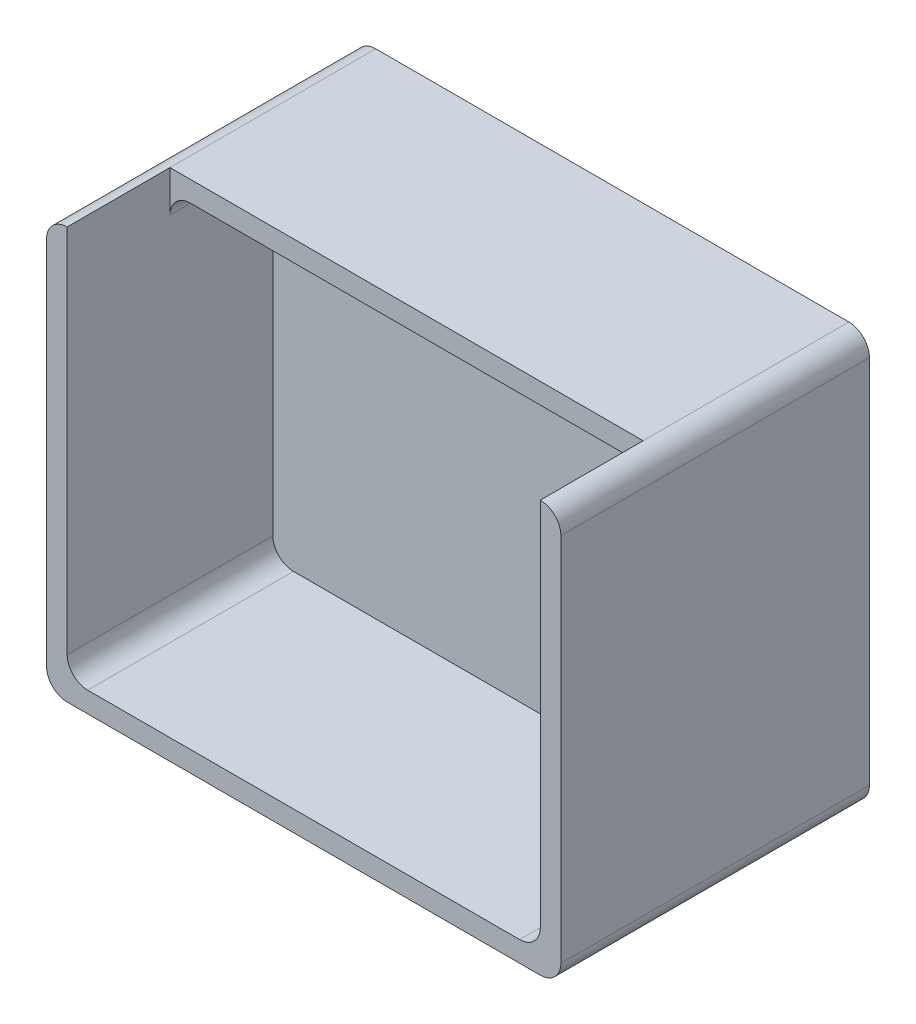
ISO-10303-21;
HEADER;
FILE_DESCRIPTION(('STEP AP214'),'2;1');
FILE_NAME('part.step','',(''),(''),'','','');
FILE_SCHEMA(('AUTOMOTIVE_DESIGN { 1 0 10303 214 1 1 1 1 }'));
ENDSEC;
DATA;
#1=APPLICATION_CONTEXT('core data for automotive mechanical design processes');
#2=APPLICATION_PROTOCOL_DEFINITION('international standard','automotive_design',2000,#1);
#3=PRODUCT_CONTEXT('',#1,'mechanical');
#4=PRODUCT('Part','Part','',(#3));
#5=PRODUCT_RELATED_PRODUCT_CATEGORY('part','',(#4));
#6=PRODUCT_DEFINITION_FORMATION('','',#4);
#7=PRODUCT_DEFINITION_CONTEXT('part definition',#1,'design');
#8=PRODUCT_DEFINITION('design','',#6,#7);
#9=PRODUCT_DEFINITION_SHAPE('','',#8);
#10=(LENGTH_UNIT() NAMED_UNIT(*) SI_UNIT(.MILLI.,.METRE.));
#11=(NAMED_UNIT(*) PLANE_ANGLE_UNIT() SI_UNIT($,.RADIAN.));
#12=(NAMED_UNIT(*) SI_UNIT($,.STERADIAN.) SOLID_ANGLE_UNIT());
#13=UNCERTAINTY_MEASURE_WITH_UNIT(LENGTH_MEASURE(1.E-05),#10,'distance_accuracy_value','');
#14=(GEOMETRIC_REPRESENTATION_CONTEXT(3) GLOBAL_UNCERTAINTY_ASSIGNED_CONTEXT((#13)) GLOBAL_UNIT_ASSIGNED_CONTEXT((#10,
#11,#12)) REPRESENTATION_CONTEXT('',''));
#15=CARTESIAN_POINT('',(0.,0.,0.));
#16=DIRECTION('',(0.,0.,1.));
#17=DIRECTION('',(1.,0.,0.));
#18=AXIS2_PLACEMENT_3D('',#15,#16,#17);
#19=CARTESIAN_POINT('',(-12.5,-10.,15.));
#20=DIRECTION('',(1.,0.,0.));
#21=DIRECTION('',(0.,0.,-1.));
#22=AXIS2_PLACEMENT_3D('',#19,#20,#21);
#23=PLANE('',#22);
#24=DIRECTION('',(0.,-1.,0.));
#25=VECTOR('',#24,1.);
#26=CARTESIAN_POINT('',(-12.5,-10.,0.));
#27=LINE('',#26,#25);
#28=CARTESIAN_POINT('',(-12.5,9.,0.));
#29=VERTEX_POINT('',#28);
#30=CARTESIAN_POINT('',(-12.5,-9.,0.));
#31=VERTEX_POINT('',#30);
#32=EDGE_CURVE('E294',#29,#31,#27,.T.);
#33=ORIENTED_EDGE('',*,*,#32,.T.);
#34=DIRECTION('',(0.,0.,-1.));
#35=VECTOR('',#34,1.);
#36=CARTESIAN_POINT('',(-12.5,-9.,15.));
#37=LINE('',#36,#35);
#38=CARTESIAN_POINT('',(-12.5,-9.,15.));
#39=VERTEX_POINT('',#38);
#40=EDGE_CURVE('E354',#31,#39,#37,.F.);
#41=ORIENTED_EDGE('',*,*,#40,.T.);
#42=DIRECTION('',(0.,-1.,0.));
#43=VECTOR('',#42,1.);
#44=CARTESIAN_POINT('',(-12.5,-10.,15.));
#45=LINE('',#44,#43);
#46=CARTESIAN_POINT('',(-12.5,9.,15.));
#47=VERTEX_POINT('',#46);
#48=EDGE_CURVE('E299',#47,#39,#45,.T.);
#49=ORIENTED_EDGE('',*,*,#48,.F.);
#50=DIRECTION('',(0.,0.,-1.));
#51=VECTOR('',#50,1.);
#52=CARTESIAN_POINT('',(-12.5,9.,15.));
#53=LINE('',#52,#51);
#54=EDGE_CURVE('E351',#47,#29,#53,.T.);
#55=ORIENTED_EDGE('',*,*,#54,.T.);
#56=EDGE_LOOP('',(#33,#41,#49,#55));
#57=FACE_BOUND('',#56,.T.);
#58=ADVANCED_FACE('F81',(#57),#23,.F.);
#59=CARTESIAN_POINT('',(12.5,-10.,15.));
#60=DIRECTION('',(0.,1.,0.));
#61=DIRECTION('',(-1.,0.,0.));
#62=AXIS2_PLACEMENT_3D('',#59,#60,#61);
#63=PLANE('',#62);
#64=DIRECTION('',(1.,0.,0.));
#65=VECTOR('',#64,1.);
#66=CARTESIAN_POINT('',(12.5,-10.,0.));
#67=LINE('',#66,#65);
#68=CARTESIAN_POINT('',(-11.5,-10.,0.));
#69=VERTEX_POINT('',#68);
#70=CARTESIAN_POINT('',(11.5,-10.,0.));
#71=VERTEX_POINT('',#70);
#72=EDGE_CURVE('E312',#69,#71,#67,.T.);
#73=ORIENTED_EDGE('',*,*,#72,.T.);
#74=DIRECTION('',(0.,0.,-1.));
#75=VECTOR('',#74,1.);
#76=CARTESIAN_POINT('',(11.5,-10.,15.));
#77=LINE('',#76,#75);
#78=CARTESIAN_POINT('',(11.5,-10.,15.));
#79=VERTEX_POINT('',#78);
#80=EDGE_CURVE('E335',#71,#79,#77,.F.);
#81=ORIENTED_EDGE('',*,*,#80,.T.);
#82=DIRECTION('',(1.,0.,0.));
#83=VECTOR('',#82,1.);
#84=CARTESIAN_POINT('',(12.5,-10.,15.));
#85=LINE('',#84,#83);
#86=CARTESIAN_POINT('',(-11.5,-10.,15.));
#87=VERTEX_POINT('',#86);
#88=EDGE_CURVE('E302',#87,#79,#85,.T.);
#89=ORIENTED_EDGE('',*,*,#88,.F.);
#90=DIRECTION('',(0.,0.,-1.));
#91=VECTOR('',#90,1.);
#92=CARTESIAN_POINT('',(-11.5,-10.,15.));
#93=LINE('',#92,#91);
#94=EDGE_CURVE('E332',#87,#69,#93,.T.);
#95=ORIENTED_EDGE('',*,*,#94,.T.);
#96=EDGE_LOOP('',(#73,#81,#89,#95));
#97=FACE_BOUND('',#96,.T.);
#98=ADVANCED_FACE('F395',(#97),#63,.F.);
#99=CARTESIAN_POINT('',(12.5,-10.,15.));
#100=DIRECTION('',(-1.,0.,0.));
#101=DIRECTION('',(0.,0.,1.));
#102=AXIS2_PLACEMENT_3D('',#99,#100,#101);
#103=PLANE('',#102);
#104=DIRECTION('',(0.,1.,0.));
#105=VECTOR('',#104,1.);
#106=CARTESIAN_POINT('',(12.5,-10.,15.));
#107=LINE('',#106,#105);
#108=CARTESIAN_POINT('',(12.5,-9.,15.));
#109=VERTEX_POINT('',#108);
#110=CARTESIAN_POINT('',(12.5,9.,15.));
#111=VERTEX_POINT('',#110);
#112=EDGE_CURVE('E306',#109,#111,#107,.T.);
#113=ORIENTED_EDGE('',*,*,#112,.F.);
#114=DIRECTION('',(0.,0.,-1.));
#115=VECTOR('',#114,1.);
#116=CARTESIAN_POINT('',(12.5,-9.,15.));
#117=LINE('',#116,#115);
#118=CARTESIAN_POINT('',(12.5,-9.,0.));
#119=VERTEX_POINT('',#118);
#120=EDGE_CURVE('E321',#109,#119,#117,.T.);
#121=ORIENTED_EDGE('',*,*,#120,.T.);
#122=DIRECTION('',(0.,1.,0.));
#123=VECTOR('',#122,1.);
#124=CARTESIAN_POINT('',(12.5,-10.,0.));
#125=LINE('',#124,#123);
#126=CARTESIAN_POINT('',(12.5,9.,0.));
#127=VERTEX_POINT('',#126);
#128=EDGE_CURVE('E315',#119,#127,#125,.T.);
#129=ORIENTED_EDGE('',*,*,#128,.T.);
#130=DIRECTION('',(0.,0.,-1.));
#131=VECTOR('',#130,1.);
#132=CARTESIAN_POINT('',(12.5,9.,15.));
#133=LINE('',#132,#131);
#134=EDGE_CURVE('E309',#127,#111,#133,.F.);
#135=ORIENTED_EDGE('',*,*,#134,.T.);
#136=EDGE_LOOP('',(#113,#121,#129,#135));
#137=FACE_BOUND('',#136,.T.);
#138=ADVANCED_FACE('F390',(#137),#103,.F.);
#139=CARTESIAN_POINT('',(12.5,10.,15.));
#140=DIRECTION('',(0.,-1.,0.));
#141=DIRECTION('',(1.,0.,0.));
#142=AXIS2_PLACEMENT_3D('',#139,#140,#141);
#143=PLANE('',#142);
#144=DIRECTION('',(0.,0.,-1.));
#145=VECTOR('',#144,1.);
#146=CARTESIAN_POINT('',(-11.5,10.,15.));
#147=LINE('',#146,#145);
#148=CARTESIAN_POINT('',(-11.5,10.,0.));
#149=VERTEX_POINT('',#148);
#150=CARTESIAN_POINT('',(-11.5,10.,10.));
#151=VERTEX_POINT('',#150);
#152=EDGE_CURVE('E346',#149,#151,#147,.F.);
#153=ORIENTED_EDGE('',*,*,#152,.T.);
#154=DIRECTION('',(-1.,0.,0.));
#155=VECTOR('',#154,1.);
#156=CARTESIAN_POINT('',(-11.5,10.,10.));
#157=LINE('',#156,#155);
#158=CARTESIAN_POINT('',(11.5,10.,10.));
#159=VERTEX_POINT('',#158);
#160=EDGE_CURVE('E220',#159,#151,#157,.T.);
#161=ORIENTED_EDGE('',*,*,#160,.F.);
#162=DIRECTION('',(0.,0.,-1.));
#163=VECTOR('',#162,1.);
#164=CARTESIAN_POINT('',(11.5,10.,15.));
#165=LINE('',#164,#163);
#166=CARTESIAN_POINT('',(11.5,10.,0.));
#167=VERTEX_POINT('',#166);
#168=EDGE_CURVE('E349',#159,#167,#165,.T.);
#169=ORIENTED_EDGE('',*,*,#168,.T.);
#170=DIRECTION('',(-1.,0.,0.));
#171=VECTOR('',#170,1.);
#172=CARTESIAN_POINT('',(12.5,10.,0.));
#173=LINE('',#172,#171);
#174=EDGE_CURVE('E303',#167,#149,#173,.T.);
#175=ORIENTED_EDGE('',*,*,#174,.T.);
#176=EDGE_LOOP('',(#153,#161,#169,#175));
#177=FACE_BOUND('',#176,.T.);
#178=ADVANCED_FACE('F382',(#177),#143,.F.);
#179=CARTESIAN_POINT('',(0.,0.,15.));
#180=DIRECTION('',(0.,0.,1.));
#181=DIRECTION('',(1.,0.,0.));
#182=AXIS2_PLACEMENT_3D('',#179,#180,#181);
#183=PLANE('',#182);
#184=DIRECTION('',(0.,-1.,0.));
#185=VECTOR('',#184,1.);
#186=CARTESIAN_POINT('',(-11.5,-9.,15.));
#187=LINE('',#186,#185);
#188=CARTESIAN_POINT('',(-11.5,10.,15.));
#189=VERTEX_POINT('',#188);
#190=CARTESIAN_POINT('',(-11.5,-8.,15.));
#191=VERTEX_POINT('',#190);
#192=EDGE_CURVE('E261',#189,#191,#187,.T.);
#193=ORIENTED_EDGE('',*,*,#192,.F.);
#194=CARTESIAN_POINT('',(-11.5,9.,15.));
#195=DIRECTION('',(0.,0.,1.));
#196=DIRECTION('',(1.,0.,0.));
#197=AXIS2_PLACEMENT_3D('',#194,#195,#196);
#198=CIRCLE('',#197,1.);
#199=EDGE_CURVE('E337',#189,#47,#198,.T.);
#200=ORIENTED_EDGE('',*,*,#199,.T.);
#201=ORIENTED_EDGE('',*,*,#48,.T.);
#202=CARTESIAN_POINT('',(-11.5,-9.,15.));
#203=DIRECTION('',(0.,0.,1.));
#204=DIRECTION('',(1.,0.,0.));
#205=AXIS2_PLACEMENT_3D('',#202,#203,#204);
#206=CIRCLE('',#205,1.);
#207=EDGE_CURVE('E339',#39,#87,#206,.T.);
#208=ORIENTED_EDGE('',*,*,#207,.T.);
#209=ORIENTED_EDGE('',*,*,#88,.T.);
#210=CARTESIAN_POINT('',(11.5,-9.,15.));
#211=DIRECTION('',(0.,0.,1.));
#212=DIRECTION('',(1.,0.,0.));
#213=AXIS2_PLACEMENT_3D('',#210,#211,#212);
#214=CIRCLE('',#213,1.);
#215=EDGE_CURVE('E344',#79,#109,#214,.T.);
#216=ORIENTED_EDGE('',*,*,#215,.T.);
#217=ORIENTED_EDGE('',*,*,#112,.T.);
#218=CARTESIAN_POINT('',(11.5,9.,15.));
#219=DIRECTION('',(0.,0.,1.));
#220=DIRECTION('',(1.,0.,0.));
#221=AXIS2_PLACEMENT_3D('',#218,#219,#220);
#222=CIRCLE('',#221,1.);
#223=CARTESIAN_POINT('',(11.5,10.,15.));
#224=VERTEX_POINT('',#223);
#225=EDGE_CURVE('E341',#111,#224,#222,.T.);
#226=ORIENTED_EDGE('',*,*,#225,.T.);
#227=DIRECTION('',(0.,1.,0.));
#228=VECTOR('',#227,1.);
#229=CARTESIAN_POINT('',(11.5,-9.,15.));
#230=LINE('',#229,#228);
#231=CARTESIAN_POINT('',(11.5,-8.,15.));
#232=VERTEX_POINT('',#231);
#233=EDGE_CURVE('E286',#232,#224,#230,.T.);
#234=ORIENTED_EDGE('',*,*,#233,.F.);
#235=CARTESIAN_POINT('',(10.5,-8.,15.));
#236=DIRECTION('',(0.,0.,1.));
#237=DIRECTION('',(1.,0.,0.));
#238=AXIS2_PLACEMENT_3D('',#235,#236,#237);
#239=CIRCLE('',#238,1.);
#240=CARTESIAN_POINT('',(10.5,-9.,15.));
#241=VERTEX_POINT('',#240);
#242=EDGE_CURVE('E101',#232,#241,#239,.F.);
#243=ORIENTED_EDGE('',*,*,#242,.T.);
#244=DIRECTION('',(1.,0.,0.));
#245=VECTOR('',#244,1.);
#246=CARTESIAN_POINT('',(11.5,-9.,15.));
#247=LINE('',#246,#245);
#248=CARTESIAN_POINT('',(-10.5,-9.,15.));
#249=VERTEX_POINT('',#248);
#250=EDGE_CURVE('E296',#249,#241,#247,.T.);
#251=ORIENTED_EDGE('',*,*,#250,.F.);
#252=CARTESIAN_POINT('',(-10.5,-8.,15.));
#253=DIRECTION('',(0.,0.,1.));
#254=DIRECTION('',(1.,0.,0.));
#255=AXIS2_PLACEMENT_3D('',#252,#253,#254);
#256=CIRCLE('',#255,1.);
#257=EDGE_CURVE('E89',#249,#191,#256,.F.);
#258=ORIENTED_EDGE('',*,*,#257,.T.);
#259=EDGE_LOOP('',(#193,#200,#201,#208,#209,#216,#217,#226,#234,#243,#251,#258));
#260=FACE_BOUND('',#259,.T.);
#261=ADVANCED_FACE('F379',(#260),#183,.T.);
#262=CARTESIAN_POINT('',(0.,0.,0.));
#263=DIRECTION('',(0.,0.,1.));
#264=DIRECTION('',(1.,0.,0.));
#265=AXIS2_PLACEMENT_3D('',#262,#263,#264);
#266=PLANE('',#265);
#267=CARTESIAN_POINT('',(-7.28446597436634,-5.31084146780714,0.));
#268=DIRECTION('',(0.,0.,1.));
#269=DIRECTION('',(1.,0.,0.));
#270=AXIS2_PLACEMENT_3D('',#267,#268,#269);
#271=CIRCLE('',#270,4.);
#272=CARTESIAN_POINT('',(-3.28446597436634,-5.31084146780714,0.));
#273=VERTEX_POINT('',#272);
#274=EDGE_CURVE('E264',#273,#273,#271,.T.);
#275=ORIENTED_EDGE('',*,*,#274,.T.);
#276=EDGE_LOOP('',(#275));
#277=FACE_BOUND('',#276,.T.);
#278=CARTESIAN_POINT('',(-7.30446597691094,5.25921550337588,0.));
#279=DIRECTION('',(0.,0.,1.));
#280=DIRECTION('',(1.,0.,0.));
#281=AXIS2_PLACEMENT_3D('',#278,#279,#280);
#282=CIRCLE('',#281,4.);
#283=CARTESIAN_POINT('',(-3.30446597691094,5.25921550337588,0.));
#284=VERTEX_POINT('',#283);
#285=EDGE_CURVE('E262',#284,#284,#282,.T.);
#286=ORIENTED_EDGE('',*,*,#285,.T.);
#287=EDGE_LOOP('',(#286));
#288=FACE_BOUND('',#287,.T.);
#289=CARTESIAN_POINT('',(7.28446597436634,-5.31084146780714,0.));
#290=DIRECTION('',(0.,0.,1.));
#291=DIRECTION('',(1.,0.,0.));
#292=AXIS2_PLACEMENT_3D('',#289,#290,#291);
#293=CIRCLE('',#292,4.);
#294=CARTESIAN_POINT('',(11.2844659743663,-5.31084146780714,0.));
#295=VERTEX_POINT('',#294);
#296=EDGE_CURVE('E258',#295,#295,#293,.F.);
#297=ORIENTED_EDGE('',*,*,#296,.F.);
#298=EDGE_LOOP('',(#297));
#299=FACE_BOUND('',#298,.T.);
#300=CARTESIAN_POINT('',(0.,0.,0.));
#301=DIRECTION('',(0.,0.,1.));
#302=DIRECTION('',(1.,0.,0.));
#303=AXIS2_PLACEMENT_3D('',#300,#301,#302);
#304=CIRCLE('',#303,4.);
#305=CARTESIAN_POINT('',(4.,0.,0.));
#306=VERTEX_POINT('',#305);
#307=EDGE_CURVE('E254',#306,#306,#304,.F.);
#308=ORIENTED_EDGE('',*,*,#307,.F.);
#309=EDGE_LOOP('',(#308));
#310=FACE_BOUND('',#309,.T.);
#311=CARTESIAN_POINT('',(7.30446597691094,5.25921550337588,0.));
#312=DIRECTION('',(0.,0.,1.));
#313=DIRECTION('',(1.,0.,0.));
#314=AXIS2_PLACEMENT_3D('',#311,#312,#313);
#315=CIRCLE('',#314,4.);
#316=CARTESIAN_POINT('',(11.3044659769109,5.25921550337588,0.));
#317=VERTEX_POINT('',#316);
#318=EDGE_CURVE('E251',#317,#317,#315,.F.);
#319=ORIENTED_EDGE('',*,*,#318,.F.);
#320=EDGE_LOOP('',(#319));
#321=FACE_BOUND('',#320,.T.);
#322=ORIENTED_EDGE('',*,*,#128,.F.);
#323=CARTESIAN_POINT('',(11.5,-9.,0.));
#324=DIRECTION('',(0.,0.,1.));
#325=DIRECTION('',(1.,0.,0.));
#326=AXIS2_PLACEMENT_3D('',#323,#324,#325);
#327=CIRCLE('',#326,1.);
#328=EDGE_CURVE('E330',#119,#71,#327,.F.);
#329=ORIENTED_EDGE('',*,*,#328,.T.);
#330=ORIENTED_EDGE('',*,*,#72,.F.);
#331=CARTESIAN_POINT('',(-11.5,-9.,0.));
#332=DIRECTION('',(0.,0.,1.));
#333=DIRECTION('',(1.,0.,0.));
#334=AXIS2_PLACEMENT_3D('',#331,#332,#333);
#335=CIRCLE('',#334,1.);
#336=EDGE_CURVE('E326',#69,#31,#335,.F.);
#337=ORIENTED_EDGE('',*,*,#336,.T.);
#338=ORIENTED_EDGE('',*,*,#32,.F.);
#339=CARTESIAN_POINT('',(-11.5,9.,0.));
#340=DIRECTION('',(0.,0.,1.));
#341=DIRECTION('',(1.,0.,0.));
#342=AXIS2_PLACEMENT_3D('',#339,#340,#341);
#343=CIRCLE('',#342,1.);
#344=EDGE_CURVE('E324',#29,#149,#343,.F.);
#345=ORIENTED_EDGE('',*,*,#344,.T.);
#346=ORIENTED_EDGE('',*,*,#174,.F.);
#347=CARTESIAN_POINT('',(11.5,9.,0.));
#348=DIRECTION('',(0.,0.,1.));
#349=DIRECTION('',(1.,0.,0.));
#350=AXIS2_PLACEMENT_3D('',#347,#348,#349);
#351=CIRCLE('',#350,1.);
#352=EDGE_CURVE('E328',#167,#127,#351,.F.);
#353=ORIENTED_EDGE('',*,*,#352,.T.);
#354=EDGE_LOOP('',(#322,#329,#330,#337,#338,#345,#346,#353));
#355=FACE_BOUND('',#354,.T.);
#356=ADVANCED_FACE('F381',(#277,#288,#299,#310,#321,#355),#266,.F.);
#357=CARTESIAN_POINT('',(11.5,-9.,15.));
#358=DIRECTION('',(0.,0.,-1.));
#359=DIRECTION('',(-1.,0.,0.));
#360=AXIS2_PLACEMENT_3D('',#357,#358,#359);
#361=CYLINDRICAL_SURFACE('',#360,1.);
#362=ORIENTED_EDGE('',*,*,#215,.F.);
#363=ORIENTED_EDGE('',*,*,#80,.F.);
#364=ORIENTED_EDGE('',*,*,#328,.F.);
#365=ORIENTED_EDGE('',*,*,#120,.F.);
#366=EDGE_LOOP('',(#362,#363,#364,#365));
#367=FACE_BOUND('',#366,.T.);
#368=ADVANCED_FACE('F388',(#367),#361,.T.);
#369=CARTESIAN_POINT('',(11.5,9.,15.));
#370=DIRECTION('',(0.,0.,-1.));
#371=DIRECTION('',(-1.,0.,0.));
#372=AXIS2_PLACEMENT_3D('',#369,#370,#371);
#373=CYLINDRICAL_SURFACE('',#372,1.);
#374=ORIENTED_EDGE('',*,*,#225,.F.);
#375=ORIENTED_EDGE('',*,*,#134,.F.);
#376=ORIENTED_EDGE('',*,*,#352,.F.);
#377=ORIENTED_EDGE('',*,*,#168,.F.);
#378=EDGE_CURVE('E217',#224,#159,#165,.T.);
#379=ORIENTED_EDGE('',*,*,#378,.F.);
#380=EDGE_LOOP('',(#374,#375,#376,#377,#379));
#381=FACE_BOUND('',#380,.T.);
#382=ADVANCED_FACE('F407',(#381),#373,.T.);
#383=CARTESIAN_POINT('',(-11.5,-9.,15.));
#384=DIRECTION('',(0.,0.,-1.));
#385=DIRECTION('',(-1.,0.,0.));
#386=AXIS2_PLACEMENT_3D('',#383,#384,#385);
#387=CYLINDRICAL_SURFACE('',#386,1.);
#388=ORIENTED_EDGE('',*,*,#207,.F.);
#389=ORIENTED_EDGE('',*,*,#40,.F.);
#390=ORIENTED_EDGE('',*,*,#336,.F.);
#391=ORIENTED_EDGE('',*,*,#94,.F.);
#392=EDGE_LOOP('',(#388,#389,#390,#391));
#393=FACE_BOUND('',#392,.T.);
#394=ADVANCED_FACE('F411',(#393),#387,.T.);
#395=CARTESIAN_POINT('',(-11.5,9.,15.));
#396=DIRECTION('',(0.,0.,-1.));
#397=DIRECTION('',(-1.,0.,0.));
#398=AXIS2_PLACEMENT_3D('',#395,#396,#397);
#399=CYLINDRICAL_SURFACE('',#398,1.);
#400=ORIENTED_EDGE('',*,*,#199,.F.);
#401=DIRECTION('',(0.,0.,1.));
#402=VECTOR('',#401,1.);
#403=CARTESIAN_POINT('',(-11.5,10.,15.));
#404=LINE('',#403,#402);
#405=EDGE_CURVE('E686',#151,#189,#404,.T.);
#406=ORIENTED_EDGE('',*,*,#405,.F.);
#407=ORIENTED_EDGE('',*,*,#152,.F.);
#408=ORIENTED_EDGE('',*,*,#344,.F.);
#409=ORIENTED_EDGE('',*,*,#54,.F.);
#410=EDGE_LOOP('',(#400,#406,#407,#408,#409));
#411=FACE_BOUND('',#410,.T.);
#412=ADVANCED_FACE('F415',(#411),#399,.T.);
#413=CARTESIAN_POINT('',(-11.5,-9.,5.));
#414=DIRECTION('',(-1.,0.,0.));
#415=DIRECTION('',(0.,0.,1.));
#416=AXIS2_PLACEMENT_3D('',#413,#414,#415);
#417=PLANE('',#416);
#418=ORIENTED_EDGE('',*,*,#192,.T.);
#419=DIRECTION('',(0.,0.,1.));
#420=VECTOR('',#419,1.);
#421=CARTESIAN_POINT('',(-11.5,-8.,5.));
#422=LINE('',#421,#420);
#423=CARTESIAN_POINT('',(-11.5,-8.,5.));
#424=VERTEX_POINT('',#423);
#425=EDGE_CURVE('E247',#191,#424,#422,.F.);
#426=ORIENTED_EDGE('',*,*,#425,.T.);
#427=DIRECTION('',(0.,-1.,0.));
#428=VECTOR('',#427,1.);
#429=CARTESIAN_POINT('',(-11.5,-9.,5.));
#430=LINE('',#429,#428);
#431=CARTESIAN_POINT('',(-11.5,8.,5.));
#432=VERTEX_POINT('',#431);
#433=EDGE_CURVE('E282',#432,#424,#430,.T.);
#434=ORIENTED_EDGE('',*,*,#433,.F.);
#435=DIRECTION('',(0.,0.,1.));
#436=VECTOR('',#435,1.);
#437=CARTESIAN_POINT('',(-11.5,8.,15.));
#438=LINE('',#437,#436);
#439=CARTESIAN_POINT('',(-11.5,8.,10.));
#440=VERTEX_POINT('',#439);
#441=EDGE_CURVE('E244',#432,#440,#438,.T.);
#442=ORIENTED_EDGE('',*,*,#441,.T.);
#443=DIRECTION('',(0.,1.,0.));
#444=VECTOR('',#443,1.);
#445=CARTESIAN_POINT('',(-11.5,8.,10.));
#446=LINE('',#445,#444);
#447=EDGE_CURVE('E219',#440,#151,#446,.T.);
#448=ORIENTED_EDGE('',*,*,#447,.T.);
#449=ORIENTED_EDGE('',*,*,#405,.T.);
#450=EDGE_LOOP('',(#418,#426,#434,#442,#448,#449));
#451=FACE_BOUND('',#450,.T.);
#452=ADVANCED_FACE('F368',(#451),#417,.F.);
#453=CARTESIAN_POINT('',(11.5,9.,5.));
#454=DIRECTION('',(0.,1.,0.));
#455=DIRECTION('',(-1.,0.,0.));
#456=AXIS2_PLACEMENT_3D('',#453,#454,#455);
#457=PLANE('',#456);
#458=DIRECTION('',(0.,0.,1.));
#459=VECTOR('',#458,1.);
#460=CARTESIAN_POINT('',(10.5,9.,15.));
#461=LINE('',#460,#459);
#462=CARTESIAN_POINT('',(10.5,9.,5.));
#463=VERTEX_POINT('',#462);
#464=CARTESIAN_POINT('',(10.5,9.,10.));
#465=VERTEX_POINT('',#464);
#466=EDGE_CURVE('E231',#463,#465,#461,.T.);
#467=ORIENTED_EDGE('',*,*,#466,.T.);
#468=DIRECTION('',(-1.,0.,0.));
#469=VECTOR('',#468,1.);
#470=CARTESIAN_POINT('',(11.5,9.,10.));
#471=LINE('',#470,#469);
#472=CARTESIAN_POINT('',(-10.5,9.,10.));
#473=VERTEX_POINT('',#472);
#474=EDGE_CURVE('E204',#465,#473,#471,.T.);
#475=ORIENTED_EDGE('',*,*,#474,.T.);
#476=DIRECTION('',(0.,0.,1.));
#477=VECTOR('',#476,1.);
#478=CARTESIAN_POINT('',(-10.5,9.,5.));
#479=LINE('',#478,#477);
#480=CARTESIAN_POINT('',(-10.5,9.,5.));
#481=VERTEX_POINT('',#480);
#482=EDGE_CURVE('E356',#473,#481,#479,.F.);
#483=ORIENTED_EDGE('',*,*,#482,.T.);
#484=DIRECTION('',(-1.,0.,0.));
#485=VECTOR('',#484,1.);
#486=CARTESIAN_POINT('',(11.5,9.,5.));
#487=LINE('',#486,#485);
#488=EDGE_CURVE('E291',#463,#481,#487,.T.);
#489=ORIENTED_EDGE('',*,*,#488,.F.);
#490=EDGE_LOOP('',(#467,#475,#483,#489));
#491=FACE_BOUND('',#490,.T.);
#492=ADVANCED_FACE('F359',(#491),#457,.F.);
#493=CARTESIAN_POINT('',(11.5,-9.,5.));
#494=DIRECTION('',(1.,0.,0.));
#495=DIRECTION('',(0.,0.,-1.));
#496=AXIS2_PLACEMENT_3D('',#493,#494,#495);
#497=PLANE('',#496);
#498=ORIENTED_EDGE('',*,*,#233,.T.);
#499=ORIENTED_EDGE('',*,*,#378,.T.);
#500=DIRECTION('',(0.,1.,0.));
#501=VECTOR('',#500,1.);
#502=CARTESIAN_POINT('',(11.5,8.,10.));
#503=LINE('',#502,#501);
#504=CARTESIAN_POINT('',(11.5,8.,10.));
#505=VERTEX_POINT('',#504);
#506=EDGE_CURVE('E201',#505,#159,#503,.T.);
#507=ORIENTED_EDGE('',*,*,#506,.F.);
#508=DIRECTION('',(0.,0.,1.));
#509=VECTOR('',#508,1.);
#510=CARTESIAN_POINT('',(11.5,8.,5.));
#511=LINE('',#510,#509);
#512=CARTESIAN_POINT('',(11.5,8.,5.));
#513=VERTEX_POINT('',#512);
#514=EDGE_CURVE('E214',#505,#513,#511,.F.);
#515=ORIENTED_EDGE('',*,*,#514,.T.);
#516=DIRECTION('',(0.,1.,0.));
#517=VECTOR('',#516,1.);
#518=CARTESIAN_POINT('',(11.5,-9.,5.));
#519=LINE('',#518,#517);
#520=CARTESIAN_POINT('',(11.5,-8.,5.));
#521=VERTEX_POINT('',#520);
#522=EDGE_CURVE('E289',#521,#513,#519,.T.);
#523=ORIENTED_EDGE('',*,*,#522,.F.);
#524=DIRECTION('',(0.,0.,1.));
#525=VECTOR('',#524,1.);
#526=CARTESIAN_POINT('',(11.5,-8.,15.));
#527=LINE('',#526,#525);
#528=EDGE_CURVE('E226',#521,#232,#527,.T.);
#529=ORIENTED_EDGE('',*,*,#528,.T.);
#530=EDGE_LOOP('',(#498,#499,#507,#515,#523,#529));
#531=FACE_BOUND('',#530,.T.);
#532=ADVANCED_FACE('F212',(#531),#497,.F.);
#533=CARTESIAN_POINT('',(11.5,-9.,5.));
#534=DIRECTION('',(0.,-1.,0.));
#535=DIRECTION('',(1.,0.,0.));
#536=AXIS2_PLACEMENT_3D('',#533,#534,#535);
#537=PLANE('',#536);
#538=ORIENTED_EDGE('',*,*,#250,.T.);
#539=DIRECTION('',(0.,0.,1.));
#540=VECTOR('',#539,1.);
#541=CARTESIAN_POINT('',(10.5,-9.,5.));
#542=LINE('',#541,#540);
#543=CARTESIAN_POINT('',(10.5,-9.,5.));
#544=VERTEX_POINT('',#543);
#545=EDGE_CURVE('E242',#241,#544,#542,.F.);
#546=ORIENTED_EDGE('',*,*,#545,.T.);
#547=DIRECTION('',(1.,0.,0.));
#548=VECTOR('',#547,1.);
#549=CARTESIAN_POINT('',(11.5,-9.,5.));
#550=LINE('',#549,#548);
#551=CARTESIAN_POINT('',(-10.5,-9.,5.));
#552=VERTEX_POINT('',#551);
#553=EDGE_CURVE('E285',#552,#544,#550,.T.);
#554=ORIENTED_EDGE('',*,*,#553,.F.);
#555=DIRECTION('',(0.,0.,1.));
#556=VECTOR('',#555,1.);
#557=CARTESIAN_POINT('',(-10.5,-9.,15.));
#558=LINE('',#557,#556);
#559=EDGE_CURVE('E239',#552,#249,#558,.T.);
#560=ORIENTED_EDGE('',*,*,#559,.T.);
#561=EDGE_LOOP('',(#538,#546,#554,#560));
#562=FACE_BOUND('',#561,.T.);
#563=ADVANCED_FACE('F377',(#562),#537,.F.);
#564=CARTESIAN_POINT('',(0.,0.,5.));
#565=DIRECTION('',(0.,0.,1.));
#566=DIRECTION('',(1.,0.,0.));
#567=AXIS2_PLACEMENT_3D('',#564,#565,#566);
#568=PLANE('',#567);
#569=ORIENTED_EDGE('',*,*,#522,.T.);
#570=CARTESIAN_POINT('',(10.5,8.,5.));
#571=DIRECTION('',(0.,0.,1.));
#572=DIRECTION('',(1.,0.,0.));
#573=AXIS2_PLACEMENT_3D('',#570,#571,#572);
#574=CIRCLE('',#573,1.);
#575=EDGE_CURVE('E224',#513,#463,#574,.T.);
#576=ORIENTED_EDGE('',*,*,#575,.T.);
#577=ORIENTED_EDGE('',*,*,#488,.T.);
#578=CARTESIAN_POINT('',(-10.5,8.,5.));
#579=DIRECTION('',(0.,0.,1.));
#580=DIRECTION('',(1.,0.,0.));
#581=AXIS2_PLACEMENT_3D('',#578,#579,#580);
#582=CIRCLE('',#581,1.);
#583=EDGE_CURVE('E225',#481,#432,#582,.T.);
#584=ORIENTED_EDGE('',*,*,#583,.T.);
#585=ORIENTED_EDGE('',*,*,#433,.T.);
#586=CARTESIAN_POINT('',(-10.5,-8.,5.));
#587=DIRECTION('',(0.,0.,1.));
#588=DIRECTION('',(1.,0.,0.));
#589=AXIS2_PLACEMENT_3D('',#586,#587,#588);
#590=CIRCLE('',#589,1.);
#591=EDGE_CURVE('E228',#424,#552,#590,.T.);
#592=ORIENTED_EDGE('',*,*,#591,.T.);
#593=ORIENTED_EDGE('',*,*,#553,.T.);
#594=CARTESIAN_POINT('',(10.5,-8.,5.));
#595=DIRECTION('',(0.,0.,1.));
#596=DIRECTION('',(1.,0.,0.));
#597=AXIS2_PLACEMENT_3D('',#594,#595,#596);
#598=CIRCLE('',#597,1.);
#599=EDGE_CURVE('E236',#544,#521,#598,.T.);
#600=ORIENTED_EDGE('',*,*,#599,.T.);
#601=EDGE_LOOP('',(#569,#576,#577,#584,#585,#592,#593,#600));
#602=FACE_BOUND('',#601,.T.);
#603=ADVANCED_FACE('F363',(#602),#568,.T.);
#604=CARTESIAN_POINT('',(10.5,8.,5.));
#605=DIRECTION('',(0.,0.,-1.));
#606=DIRECTION('',(-1.,0.,0.));
#607=AXIS2_PLACEMENT_3D('',#604,#605,#606);
#608=CYLINDRICAL_SURFACE('',#607,1.);
#609=ORIENTED_EDGE('',*,*,#514,.F.);
#610=CARTESIAN_POINT('',(10.5,8.,10.));
#611=DIRECTION('',(0.,0.,-1.));
#612=DIRECTION('',(-1.,0.,0.));
#613=AXIS2_PLACEMENT_3D('',#610,#611,#612);
#614=CIRCLE('',#613,1.);
#615=EDGE_CURVE('E197',#505,#465,#614,.F.);
#616=ORIENTED_EDGE('',*,*,#615,.T.);
#617=ORIENTED_EDGE('',*,*,#466,.F.);
#618=ORIENTED_EDGE('',*,*,#575,.F.);
#619=EDGE_LOOP('',(#609,#616,#617,#618));
#620=FACE_BOUND('',#619,.T.);
#621=ADVANCED_FACE('F223',(#620),#608,.F.);
#622=CARTESIAN_POINT('',(10.5,-8.,5.));
#623=DIRECTION('',(0.,0.,-1.));
#624=DIRECTION('',(-1.,0.,0.));
#625=AXIS2_PLACEMENT_3D('',#622,#623,#624);
#626=CYLINDRICAL_SURFACE('',#625,1.);
#627=ORIENTED_EDGE('',*,*,#599,.F.);
#628=ORIENTED_EDGE('',*,*,#545,.F.);
#629=ORIENTED_EDGE('',*,*,#242,.F.);
#630=ORIENTED_EDGE('',*,*,#528,.F.);
#631=EDGE_LOOP('',(#627,#628,#629,#630));
#632=FACE_BOUND('',#631,.T.);
#633=ADVANCED_FACE('F422',(#632),#626,.F.);
#634=CARTESIAN_POINT('',(-10.5,-8.,5.));
#635=DIRECTION('',(0.,0.,-1.));
#636=DIRECTION('',(-1.,0.,0.));
#637=AXIS2_PLACEMENT_3D('',#634,#635,#636);
#638=CYLINDRICAL_SURFACE('',#637,1.);
#639=ORIENTED_EDGE('',*,*,#591,.F.);
#640=ORIENTED_EDGE('',*,*,#425,.F.);
#641=ORIENTED_EDGE('',*,*,#257,.F.);
#642=ORIENTED_EDGE('',*,*,#559,.F.);
#643=EDGE_LOOP('',(#639,#640,#641,#642));
#644=FACE_BOUND('',#643,.T.);
#645=ADVANCED_FACE('F375',(#644),#638,.F.);
#646=CARTESIAN_POINT('',(-10.5,8.,5.));
#647=DIRECTION('',(0.,0.,-1.));
#648=DIRECTION('',(-1.,0.,0.));
#649=AXIS2_PLACEMENT_3D('',#646,#647,#648);
#650=CYLINDRICAL_SURFACE('',#649,1.);
#651=ORIENTED_EDGE('',*,*,#482,.F.);
#652=CARTESIAN_POINT('',(-10.5,8.,10.));
#653=DIRECTION('',(0.,0.,-1.));
#654=DIRECTION('',(-1.,0.,0.));
#655=AXIS2_PLACEMENT_3D('',#652,#653,#654);
#656=CIRCLE('',#655,1.);
#657=EDGE_CURVE('E12',#473,#440,#656,.F.);
#658=ORIENTED_EDGE('',*,*,#657,.T.);
#659=ORIENTED_EDGE('',*,*,#441,.F.);
#660=ORIENTED_EDGE('',*,*,#583,.F.);
#661=EDGE_LOOP('',(#651,#658,#659,#660));
#662=FACE_BOUND('',#661,.T.);
#663=ADVANCED_FACE('F83',(#662),#650,.F.);
#664=CARTESIAN_POINT('',(7.30446597691094,5.25921550337588,2.5));
#665=DIRECTION('',(0.,0.,-1.));
#666=DIRECTION('',(-1.,0.,0.));
#667=AXIS2_PLACEMENT_3D('',#664,#665,#666);
#668=CYLINDRICAL_SURFACE('',#667,4.);
#669=CARTESIAN_POINT('',(7.30446597691094,5.25921550337588,2.5));
#670=DIRECTION('',(0.,0.,1.));
#671=DIRECTION('',(1.,0.,0.));
#672=AXIS2_PLACEMENT_3D('',#669,#670,#671);
#673=CIRCLE('',#672,4.);
#674=CARTESIAN_POINT('',(11.3044659769109,5.25921550337588,2.5));
#675=VERTEX_POINT('',#674);
#676=EDGE_CURVE('E255',#675,#675,#673,.T.);
#677=ORIENTED_EDGE('',*,*,#676,.T.);
#678=EDGE_LOOP('',(#677));
#679=FACE_BOUND('',#678,.T.);
#680=ORIENTED_EDGE('',*,*,#318,.T.);
#681=EDGE_LOOP('',(#680));
#682=FACE_BOUND('',#681,.T.);
#683=ADVANCED_FACE('F429',(#679,#682),#668,.F.);
#684=CARTESIAN_POINT('',(7.30446597691094,5.25921550337588,2.5));
#685=DIRECTION('',(0.,0.,1.));
#686=DIRECTION('',(1.,0.,0.));
#687=AXIS2_PLACEMENT_3D('',#684,#685,#686);
#688=PLANE('',#687);
#689=ORIENTED_EDGE('',*,*,#676,.F.);
#690=EDGE_LOOP('',(#689));
#691=FACE_BOUND('',#690,.T.);
#692=ADVANCED_FACE('F433',(#691),#688,.F.);
#693=CARTESIAN_POINT('',(0.,0.,2.5));
#694=DIRECTION('',(0.,0.,-1.));
#695=DIRECTION('',(-1.,0.,0.));
#696=AXIS2_PLACEMENT_3D('',#693,#694,#695);
#697=CYLINDRICAL_SURFACE('',#696,4.);
#698=CARTESIAN_POINT('',(0.,0.,2.5));
#699=DIRECTION('',(0.,0.,1.));
#700=DIRECTION('',(1.,0.,0.));
#701=AXIS2_PLACEMENT_3D('',#698,#699,#700);
#702=CIRCLE('',#701,4.);
#703=CARTESIAN_POINT('',(4.,0.,2.5));
#704=VERTEX_POINT('',#703);
#705=EDGE_CURVE('E267',#704,#704,#702,.T.);
#706=ORIENTED_EDGE('',*,*,#705,.T.);
#707=EDGE_LOOP('',(#706));
#708=FACE_BOUND('',#707,.T.);
#709=ORIENTED_EDGE('',*,*,#307,.T.);
#710=EDGE_LOOP('',(#709));
#711=FACE_BOUND('',#710,.T.);
#712=ADVANCED_FACE('F439',(#708,#711),#697,.F.);
#713=CARTESIAN_POINT('',(0.,0.,2.5));
#714=DIRECTION('',(0.,0.,1.));
#715=DIRECTION('',(1.,0.,0.));
#716=AXIS2_PLACEMENT_3D('',#713,#714,#715);
#717=PLANE('',#716);
#718=ORIENTED_EDGE('',*,*,#705,.F.);
#719=EDGE_LOOP('',(#718));
#720=FACE_BOUND('',#719,.T.);
#721=ADVANCED_FACE('F506',(#720),#717,.F.);
#722=CARTESIAN_POINT('',(7.28446597436634,-5.31084146780714,2.5));
#723=DIRECTION('',(0.,0.,-1.));
#724=DIRECTION('',(-1.,0.,0.));
#725=AXIS2_PLACEMENT_3D('',#722,#723,#724);
#726=CYLINDRICAL_SURFACE('',#725,4.);
#727=CARTESIAN_POINT('',(7.28446597436634,-5.31084146780714,2.5));
#728=DIRECTION('',(0.,0.,1.));
#729=DIRECTION('',(1.,0.,0.));
#730=AXIS2_PLACEMENT_3D('',#727,#728,#729);
#731=CIRCLE('',#730,4.);
#732=CARTESIAN_POINT('',(11.2844659743663,-5.31084146780714,2.5));
#733=VERTEX_POINT('',#732);
#734=EDGE_CURVE('E271',#733,#733,#731,.T.);
#735=ORIENTED_EDGE('',*,*,#734,.T.);
#736=EDGE_LOOP('',(#735));
#737=FACE_BOUND('',#736,.T.);
#738=ORIENTED_EDGE('',*,*,#296,.T.);
#739=EDGE_LOOP('',(#738));
#740=FACE_BOUND('',#739,.T.);
#741=ADVANCED_FACE('F515',(#737,#740),#726,.F.);
#742=CARTESIAN_POINT('',(7.28446597436634,-5.31084146780714,2.5));
#743=DIRECTION('',(0.,0.,1.));
#744=DIRECTION('',(1.,0.,0.));
#745=AXIS2_PLACEMENT_3D('',#742,#743,#744);
#746=PLANE('',#745);
#747=ORIENTED_EDGE('',*,*,#734,.F.);
#748=EDGE_LOOP('',(#747));
#749=FACE_BOUND('',#748,.T.);
#750=ADVANCED_FACE('F525',(#749),#746,.F.);
#751=CARTESIAN_POINT('',(-7.30446597691094,5.25921550337588,2.5));
#752=DIRECTION('',(0.,0.,-1.));
#753=DIRECTION('',(-1.,0.,0.));
#754=AXIS2_PLACEMENT_3D('',#751,#752,#753);
#755=CYLINDRICAL_SURFACE('',#754,4.);
#756=CARTESIAN_POINT('',(-7.30446597691094,5.25921550337588,2.5));
#757=DIRECTION('',(0.,0.,-1.));
#758=DIRECTION('',(-1.,0.,0.));
#759=AXIS2_PLACEMENT_3D('',#756,#757,#758);
#760=CIRCLE('',#759,4.);
#761=CARTESIAN_POINT('',(-11.3044659769109,5.25921550337588,2.5));
#762=VERTEX_POINT('',#761);
#763=EDGE_CURVE('E265',#762,#762,#760,.T.);
#764=ORIENTED_EDGE('',*,*,#763,.F.);
#765=EDGE_LOOP('',(#764));
#766=FACE_BOUND('',#765,.T.);
#767=ORIENTED_EDGE('',*,*,#285,.F.);
#768=EDGE_LOOP('',(#767));
#769=FACE_BOUND('',#768,.T.);
#770=ADVANCED_FACE('F535',(#766,#769),#755,.F.);
#771=CARTESIAN_POINT('',(-7.30446597691094,5.25921550337588,2.5));
#772=DIRECTION('',(0.,0.,1.));
#773=DIRECTION('',(-1.,0.,0.));
#774=AXIS2_PLACEMENT_3D('',#771,#772,#773);
#775=PLANE('',#774);
#776=ORIENTED_EDGE('',*,*,#763,.T.);
#777=EDGE_LOOP('',(#776));
#778=FACE_BOUND('',#777,.T.);
#779=ADVANCED_FACE('F552',(#778),#775,.F.);
#780=CARTESIAN_POINT('',(-7.28446597436634,-5.31084146780714,2.5));
#781=DIRECTION('',(0.,0.,-1.));
#782=DIRECTION('',(-1.,0.,0.));
#783=AXIS2_PLACEMENT_3D('',#780,#781,#782);
#784=CYLINDRICAL_SURFACE('',#783,4.);
#785=CARTESIAN_POINT('',(-7.28446597436634,-5.31084146780714,2.5));
#786=DIRECTION('',(0.,0.,-1.));
#787=DIRECTION('',(-1.,0.,0.));
#788=AXIS2_PLACEMENT_3D('',#785,#786,#787);
#789=CIRCLE('',#788,4.);
#790=CARTESIAN_POINT('',(-11.2844659743663,-5.31084146780714,2.5));
#791=VERTEX_POINT('',#790);
#792=EDGE_CURVE('E209',#791,#791,#789,.T.);
#793=ORIENTED_EDGE('',*,*,#792,.F.);
#794=EDGE_LOOP('',(#793));
#795=FACE_BOUND('',#794,.T.);
#796=ORIENTED_EDGE('',*,*,#274,.F.);
#797=EDGE_LOOP('',(#796));
#798=FACE_BOUND('',#797,.T.);
#799=ADVANCED_FACE('F562',(#795,#798),#784,.F.);
#800=CARTESIAN_POINT('',(-7.28446597436634,-5.31084146780714,2.5));
#801=DIRECTION('',(0.,0.,1.));
#802=DIRECTION('',(-1.,0.,0.));
#803=AXIS2_PLACEMENT_3D('',#800,#801,#802);
#804=PLANE('',#803);
#805=ORIENTED_EDGE('',*,*,#792,.T.);
#806=EDGE_LOOP('',(#805));
#807=FACE_BOUND('',#806,.T.);
#808=ADVANCED_FACE('F572',(#807),#804,.F.);
#809=CARTESIAN_POINT('',(-11.5,8.,10.));
#810=DIRECTION('',(0.,0.,-1.));
#811=DIRECTION('',(-1.,0.,0.));
#812=AXIS2_PLACEMENT_3D('',#809,#810,#811);
#813=PLANE('',#812);
#814=ORIENTED_EDGE('',*,*,#506,.T.);
#815=ORIENTED_EDGE('',*,*,#160,.T.);
#816=ORIENTED_EDGE('',*,*,#447,.F.);
#817=ORIENTED_EDGE('',*,*,#657,.F.);
#818=ORIENTED_EDGE('',*,*,#474,.F.);
#819=ORIENTED_EDGE('',*,*,#615,.F.);
#820=EDGE_LOOP('',(#814,#815,#816,#817,#818,#819));
#821=FACE_BOUND('',#820,.T.);
#822=ADVANCED_FACE('F199',(#821),#813,.F.);
#823=CLOSED_SHELL('',(#58,#98,#138,#178,#261,#356,#368,#382,#394,#412,#452,#492,#532,#563,#603,
#621,#633,#645,#663,#683,#692,#712,#721,#741,#750,#770,#779,#799,#808,#822));
#824=MANIFOLD_SOLID_BREP('B2',#823);
#825=ADVANCED_BREP_SHAPE_REPRESENTATION('',(#18,#824),#14);
#826=SHAPE_DEFINITION_REPRESENTATION(#9,#825);
ENDSEC;
END-ISO-10303-21;
